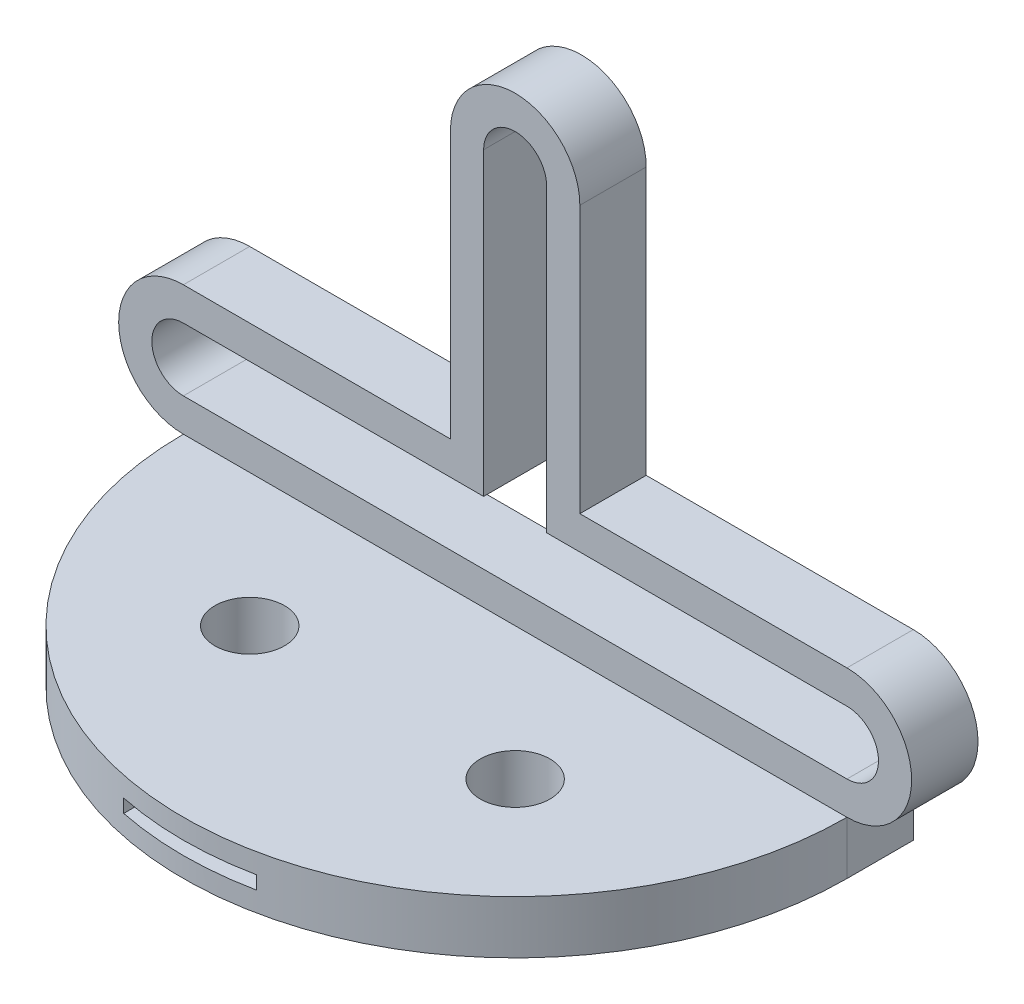
ISO-10303-21;
HEADER;
FILE_DESCRIPTION(('STEP AP214'),'2;1');
FILE_NAME('part.step','',(''),(''),'','','');
FILE_SCHEMA(('AUTOMOTIVE_DESIGN { 1 0 10303 214 1 1 1 1 }'));
ENDSEC;
DATA;
#1=APPLICATION_CONTEXT('core data for automotive mechanical design processes');
#2=APPLICATION_PROTOCOL_DEFINITION('international standard','automotive_design',2000,#1);
#3=PRODUCT_CONTEXT('',#1,'mechanical');
#4=PRODUCT('Part','Part','',(#3));
#5=PRODUCT_RELATED_PRODUCT_CATEGORY('part','',(#4));
#6=PRODUCT_DEFINITION_FORMATION('','',#4);
#7=PRODUCT_DEFINITION_CONTEXT('part definition',#1,'design');
#8=PRODUCT_DEFINITION('design','',#6,#7);
#9=PRODUCT_DEFINITION_SHAPE('','',#8);
#10=(LENGTH_UNIT() NAMED_UNIT(*) SI_UNIT(.MILLI.,.METRE.));
#11=(NAMED_UNIT(*) PLANE_ANGLE_UNIT() SI_UNIT($,.RADIAN.));
#12=(NAMED_UNIT(*) SI_UNIT($,.STERADIAN.) SOLID_ANGLE_UNIT());
#13=UNCERTAINTY_MEASURE_WITH_UNIT(LENGTH_MEASURE(1.E-05),#10,'distance_accuracy_value','');
#14=(GEOMETRIC_REPRESENTATION_CONTEXT(3) GLOBAL_UNCERTAINTY_ASSIGNED_CONTEXT((#13)) GLOBAL_UNIT_ASSIGNED_CONTEXT((#10,
#11,#12)) REPRESENTATION_CONTEXT('',''));
#15=CARTESIAN_POINT('',(0.,0.,0.));
#16=DIRECTION('',(0.,0.,1.));
#17=DIRECTION('',(1.,0.,0.));
#18=AXIS2_PLACEMENT_3D('',#15,#16,#17);
#19=CARTESIAN_POINT('',(10.,-14.75,50.));
#20=DIRECTION('',(0.,-1.,0.));
#21=DIRECTION('',(0.,0.,-1.));
#22=AXIS2_PLACEMENT_3D('',#19,#20,#21);
#23=PLANE('',#22);
#24=DIRECTION('',(0.,0.,-1.));
#25=VECTOR('',#24,1.);
#26=CARTESIAN_POINT('',(10.,-14.75,50.));
#27=LINE('',#26,#25);
#28=CARTESIAN_POINT('',(10.,-14.75,48.9897948556635));
#29=VERTEX_POINT('',#28);
#30=CARTESIAN_POINT('',(10.,-14.75,20.));
#31=VERTEX_POINT('',#30);
#32=EDGE_CURVE('E201',#29,#31,#27,.T.);
#33=ORIENTED_EDGE('',*,*,#32,.T.);
#34=CARTESIAN_POINT('',(0.,-14.75,20.));
#35=DIRECTION('',(0.,-1.,0.));
#36=DIRECTION('',(0.,0.,-1.));
#37=AXIS2_PLACEMENT_3D('',#34,#35,#36);
#38=CIRCLE('',#37,10.);
#39=CARTESIAN_POINT('',(-10.,-14.75,20.));
#40=VERTEX_POINT('',#39);
#41=EDGE_CURVE('E48',#40,#31,#38,.F.);
#42=ORIENTED_EDGE('',*,*,#41,.F.);
#43=DIRECTION('',(0.,0.,-1.));
#44=VECTOR('',#43,1.);
#45=CARTESIAN_POINT('',(-10.,-14.75,50.));
#46=LINE('',#45,#44);
#47=CARTESIAN_POINT('',(-10.,-14.75,48.9897948556635));
#48=VERTEX_POINT('',#47);
#49=EDGE_CURVE('E199',#48,#40,#46,.T.);
#50=ORIENTED_EDGE('',*,*,#49,.F.);
#51=CARTESIAN_POINT('',(0.,-14.75,0.));
#52=DIRECTION('',(0.,-1.,0.));
#53=DIRECTION('',(0.,0.,-1.));
#54=AXIS2_PLACEMENT_3D('',#51,#52,#53);
#55=CIRCLE('',#54,50.);
#56=EDGE_CURVE('E42',#48,#29,#55,.F.);
#57=ORIENTED_EDGE('',*,*,#56,.T.);
#58=EDGE_LOOP('',(#33,#42,#50,#57));
#59=FACE_BOUND('',#58,.T.);
#60=ADVANCED_FACE('F34',(#59),#23,.F.);
#61=CARTESIAN_POINT('',(0.,4.75,-10.));
#62=DIRECTION('',(0.,-1.,0.));
#63=DIRECTION('',(1.,0.,0.));
#64=AXIS2_PLACEMENT_3D('',#61,#62,#63);
#65=PLANE('',#64);
#66=DIRECTION('',(1.,0.,0.));
#67=VECTOR('',#66,1.);
#68=CARTESIAN_POINT('',(0.,4.75,0.));
#69=LINE('',#68,#67);
#70=CARTESIAN_POINT('',(4.75000000000001,4.75,0.));
#71=VERTEX_POINT('',#70);
#72=CARTESIAN_POINT('',(50.,4.75,0.));
#73=VERTEX_POINT('',#72);
#74=EDGE_CURVE('E316',#71,#73,#69,.T.);
#75=ORIENTED_EDGE('',*,*,#74,.F.);
#76=DIRECTION('',(0.,0.,1.));
#77=VECTOR('',#76,1.);
#78=CARTESIAN_POINT('',(4.75000000000001,4.75,-10.));
#79=LINE('',#78,#77);
#80=CARTESIAN_POINT('',(4.75000000000001,4.75,-10.));
#81=VERTEX_POINT('',#80);
#82=EDGE_CURVE('E339',#81,#71,#79,.T.);
#83=ORIENTED_EDGE('',*,*,#82,.F.);
#84=DIRECTION('',(1.,0.,0.));
#85=VECTOR('',#84,1.);
#86=CARTESIAN_POINT('',(0.,4.75,-10.));
#87=LINE('',#86,#85);
#88=CARTESIAN_POINT('',(50.,4.75,-10.));
#89=VERTEX_POINT('',#88);
#90=EDGE_CURVE('E268',#81,#89,#87,.T.);
#91=ORIENTED_EDGE('',*,*,#90,.T.);
#92=DIRECTION('',(0.,0.,1.));
#93=VECTOR('',#92,1.);
#94=CARTESIAN_POINT('',(50.,4.75,-10.));
#95=LINE('',#94,#93);
#96=EDGE_CURVE('E357',#89,#73,#95,.T.);
#97=ORIENTED_EDGE('',*,*,#96,.T.);
#98=EDGE_LOOP('',(#75,#83,#91,#97));
#99=FACE_BOUND('',#98,.T.);
#100=ADVANCED_FACE('F469',(#99),#65,.T.);
#101=CARTESIAN_POINT('',(4.75000000000001,0.,-10.));
#102=DIRECTION('',(-1.,0.,0.));
#103=DIRECTION('',(0.,-1.,0.));
#104=AXIS2_PLACEMENT_3D('',#101,#102,#103);
#105=PLANE('',#104);
#106=DIRECTION('',(0.,-1.,0.));
#107=VECTOR('',#106,1.);
#108=CARTESIAN_POINT('',(4.75000000000001,0.,0.));
#109=LINE('',#108,#107);
#110=CARTESIAN_POINT('',(4.75,50.,0.));
#111=VERTEX_POINT('',#110);
#112=EDGE_CURVE('E244',#111,#71,#109,.T.);
#113=ORIENTED_EDGE('',*,*,#112,.F.);
#114=DIRECTION('',(0.,0.,1.));
#115=VECTOR('',#114,1.);
#116=CARTESIAN_POINT('',(4.75,50.,-10.));
#117=LINE('',#116,#115);
#118=CARTESIAN_POINT('',(4.75,50.,-10.));
#119=VERTEX_POINT('',#118);
#120=EDGE_CURVE('E342',#119,#111,#117,.T.);
#121=ORIENTED_EDGE('',*,*,#120,.F.);
#122=DIRECTION('',(0.,-1.,0.));
#123=VECTOR('',#122,1.);
#124=CARTESIAN_POINT('',(4.75000000000001,0.,-10.));
#125=LINE('',#124,#123);
#126=EDGE_CURVE('E288',#119,#81,#125,.T.);
#127=ORIENTED_EDGE('',*,*,#126,.T.);
#128=ORIENTED_EDGE('',*,*,#82,.T.);
#129=EDGE_LOOP('',(#113,#121,#127,#128));
#130=FACE_BOUND('',#129,.T.);
#131=ADVANCED_FACE('F474',(#130),#105,.T.);
#132=CARTESIAN_POINT('',(0.,50.,-10.));
#133=DIRECTION('',(0.,0.,1.));
#134=DIRECTION('',(1.,0.,0.));
#135=AXIS2_PLACEMENT_3D('',#132,#133,#134);
#136=CYLINDRICAL_SURFACE('',#135,4.75);
#137=CARTESIAN_POINT('',(0.,50.,0.));
#138=DIRECTION('',(0.,0.,1.));
#139=DIRECTION('',(1.,0.,0.));
#140=AXIS2_PLACEMENT_3D('',#137,#138,#139);
#141=CIRCLE('',#140,4.75);
#142=CARTESIAN_POINT('',(-4.75,50.,0.));
#143=VERTEX_POINT('',#142);
#144=EDGE_CURVE('E334',#143,#111,#141,.F.);
#145=ORIENTED_EDGE('',*,*,#144,.F.);
#146=DIRECTION('',(0.,0.,1.));
#147=VECTOR('',#146,1.);
#148=CARTESIAN_POINT('',(-4.75,50.,-10.));
#149=LINE('',#148,#147);
#150=CARTESIAN_POINT('',(-4.75,50.,-10.));
#151=VERTEX_POINT('',#150);
#152=EDGE_CURVE('E344',#151,#143,#149,.T.);
#153=ORIENTED_EDGE('',*,*,#152,.F.);
#154=CARTESIAN_POINT('',(0.,50.,-10.));
#155=DIRECTION('',(0.,0.,1.));
#156=DIRECTION('',(1.,0.,0.));
#157=AXIS2_PLACEMENT_3D('',#154,#155,#156);
#158=CIRCLE('',#157,4.75);
#159=EDGE_CURVE('E285',#151,#119,#158,.F.);
#160=ORIENTED_EDGE('',*,*,#159,.T.);
#161=ORIENTED_EDGE('',*,*,#120,.T.);
#162=EDGE_LOOP('',(#145,#153,#160,#161));
#163=FACE_BOUND('',#162,.T.);
#164=ADVANCED_FACE('F510',(#163),#136,.F.);
#165=CARTESIAN_POINT('',(-4.74999999999999,0.,-10.));
#166=DIRECTION('',(-1.,0.,0.));
#167=DIRECTION('',(0.,-1.,0.));
#168=AXIS2_PLACEMENT_3D('',#165,#166,#167);
#169=PLANE('',#168);
#170=DIRECTION('',(0.,-1.,0.));
#171=VECTOR('',#170,1.);
#172=CARTESIAN_POINT('',(-4.74999999999999,0.,0.));
#173=LINE('',#172,#171);
#174=CARTESIAN_POINT('',(-4.74999999999999,4.75000000000001,0.));
#175=VERTEX_POINT('',#174);
#176=EDGE_CURVE('E331',#143,#175,#173,.T.);
#177=ORIENTED_EDGE('',*,*,#176,.T.);
#178=DIRECTION('',(0.,0.,1.));
#179=VECTOR('',#178,1.);
#180=CARTESIAN_POINT('',(-4.74999999999999,4.75000000000001,-10.));
#181=LINE('',#180,#179);
#182=CARTESIAN_POINT('',(-4.74999999999999,4.75000000000001,-10.));
#183=VERTEX_POINT('',#182);
#184=EDGE_CURVE('E346',#183,#175,#181,.T.);
#185=ORIENTED_EDGE('',*,*,#184,.F.);
#186=DIRECTION('',(0.,-1.,0.));
#187=VECTOR('',#186,1.);
#188=CARTESIAN_POINT('',(-4.74999999999999,0.,-10.));
#189=LINE('',#188,#187);
#190=EDGE_CURVE('E282',#151,#183,#189,.T.);
#191=ORIENTED_EDGE('',*,*,#190,.F.);
#192=ORIENTED_EDGE('',*,*,#152,.T.);
#193=EDGE_LOOP('',(#177,#185,#191,#192));
#194=FACE_BOUND('',#193,.T.);
#195=ADVANCED_FACE('F514',(#194),#169,.F.);
#196=CARTESIAN_POINT('',(0.,4.75000000000001,-10.));
#197=DIRECTION('',(0.,1.,0.));
#198=DIRECTION('',(-1.,0.,0.));
#199=AXIS2_PLACEMENT_3D('',#196,#197,#198);
#200=PLANE('',#199);
#201=DIRECTION('',(-1.,0.,0.));
#202=VECTOR('',#201,1.);
#203=CARTESIAN_POINT('',(0.,4.75000000000001,0.));
#204=LINE('',#203,#202);
#205=CARTESIAN_POINT('',(-50.,4.75,0.));
#206=VERTEX_POINT('',#205);
#207=EDGE_CURVE('E328',#175,#206,#204,.T.);
#208=ORIENTED_EDGE('',*,*,#207,.T.);
#209=DIRECTION('',(0.,0.,1.));
#210=VECTOR('',#209,1.);
#211=CARTESIAN_POINT('',(-50.,4.75,-10.));
#212=LINE('',#211,#210);
#213=CARTESIAN_POINT('',(-50.,4.75,-10.));
#214=VERTEX_POINT('',#213);
#215=EDGE_CURVE('E349',#214,#206,#212,.T.);
#216=ORIENTED_EDGE('',*,*,#215,.F.);
#217=DIRECTION('',(-1.,0.,0.));
#218=VECTOR('',#217,1.);
#219=CARTESIAN_POINT('',(0.,4.75000000000001,-10.));
#220=LINE('',#219,#218);
#221=EDGE_CURVE('E279',#183,#214,#220,.T.);
#222=ORIENTED_EDGE('',*,*,#221,.F.);
#223=ORIENTED_EDGE('',*,*,#184,.T.);
#224=EDGE_LOOP('',(#208,#216,#222,#223));
#225=FACE_BOUND('',#224,.T.);
#226=ADVANCED_FACE('F518',(#225),#200,.F.);
#227=CARTESIAN_POINT('',(-50.,0.,-10.));
#228=DIRECTION('',(0.,0.,1.));
#229=DIRECTION('',(1.,0.,0.));
#230=AXIS2_PLACEMENT_3D('',#227,#228,#229);
#231=CYLINDRICAL_SURFACE('',#230,4.75);
#232=CARTESIAN_POINT('',(-50.,0.,0.));
#233=DIRECTION('',(0.,0.,1.));
#234=DIRECTION('',(1.,0.,0.));
#235=AXIS2_PLACEMENT_3D('',#232,#233,#234);
#236=CIRCLE('',#235,4.75);
#237=CARTESIAN_POINT('',(-50.,-4.75,0.));
#238=VERTEX_POINT('',#237);
#239=EDGE_CURVE('E325',#206,#238,#236,.T.);
#240=ORIENTED_EDGE('',*,*,#239,.T.);
#241=DIRECTION('',(0.,0.,1.));
#242=VECTOR('',#241,1.);
#243=CARTESIAN_POINT('',(-50.,-4.75,-10.));
#244=LINE('',#243,#242);
#245=CARTESIAN_POINT('',(-50.,-4.75,-10.));
#246=VERTEX_POINT('',#245);
#247=EDGE_CURVE('E352',#246,#238,#244,.T.);
#248=ORIENTED_EDGE('',*,*,#247,.F.);
#249=CARTESIAN_POINT('',(-50.,0.,-10.));
#250=DIRECTION('',(0.,0.,1.));
#251=DIRECTION('',(1.,0.,0.));
#252=AXIS2_PLACEMENT_3D('',#249,#250,#251);
#253=CIRCLE('',#252,4.75);
#254=EDGE_CURVE('E276',#214,#246,#253,.T.);
#255=ORIENTED_EDGE('',*,*,#254,.F.);
#256=ORIENTED_EDGE('',*,*,#215,.T.);
#257=EDGE_LOOP('',(#240,#248,#255,#256));
#258=FACE_BOUND('',#257,.T.);
#259=ADVANCED_FACE('F522',(#258),#231,.F.);
#260=CARTESIAN_POINT('',(0.,-4.75,-10.));
#261=DIRECTION('',(0.,-1.,0.));
#262=DIRECTION('',(1.,0.,0.));
#263=AXIS2_PLACEMENT_3D('',#260,#261,#262);
#264=PLANE('',#263);
#265=DIRECTION('',(1.,0.,0.));
#266=VECTOR('',#265,1.);
#267=CARTESIAN_POINT('',(0.,-4.75,0.));
#268=LINE('',#267,#266);
#269=CARTESIAN_POINT('',(50.,-4.75,0.));
#270=VERTEX_POINT('',#269);
#271=EDGE_CURVE('E322',#238,#270,#268,.T.);
#272=ORIENTED_EDGE('',*,*,#271,.T.);
#273=DIRECTION('',(0.,0.,1.));
#274=VECTOR('',#273,1.);
#275=CARTESIAN_POINT('',(50.,-4.75,-10.));
#276=LINE('',#275,#274);
#277=CARTESIAN_POINT('',(50.,-4.75,-10.));
#278=VERTEX_POINT('',#277);
#279=EDGE_CURVE('E355',#278,#270,#276,.T.);
#280=ORIENTED_EDGE('',*,*,#279,.F.);
#281=DIRECTION('',(1.,0.,0.));
#282=VECTOR('',#281,1.);
#283=CARTESIAN_POINT('',(0.,-4.75,-10.));
#284=LINE('',#283,#282);
#285=EDGE_CURVE('E274',#246,#278,#284,.T.);
#286=ORIENTED_EDGE('',*,*,#285,.F.);
#287=ORIENTED_EDGE('',*,*,#247,.T.);
#288=EDGE_LOOP('',(#272,#280,#286,#287));
#289=FACE_BOUND('',#288,.T.);
#290=ADVANCED_FACE('F526',(#289),#264,.F.);
#291=CARTESIAN_POINT('',(0.,50.,-10.));
#292=DIRECTION('',(0.,0.,1.));
#293=DIRECTION('',(1.,0.,0.));
#294=AXIS2_PLACEMENT_3D('',#291,#292,#293);
#295=CYLINDRICAL_SURFACE('',#294,9.75);
#296=CARTESIAN_POINT('',(0.,50.,0.));
#297=DIRECTION('',(0.,0.,1.));
#298=DIRECTION('',(1.,0.,0.));
#299=AXIS2_PLACEMENT_3D('',#296,#297,#298);
#300=CIRCLE('',#299,9.75);
#301=CARTESIAN_POINT('',(-9.75,50.,0.));
#302=VERTEX_POINT('',#301);
#303=CARTESIAN_POINT('',(9.75,50.,0.));
#304=VERTEX_POINT('',#303);
#305=EDGE_CURVE('E237',#302,#304,#300,.F.);
#306=ORIENTED_EDGE('',*,*,#305,.T.);
#307=DIRECTION('',(0.,0.,1.));
#308=VECTOR('',#307,1.);
#309=CARTESIAN_POINT('',(9.75,50.,-10.));
#310=LINE('',#309,#308);
#311=CARTESIAN_POINT('',(9.75,50.,-10.));
#312=VERTEX_POINT('',#311);
#313=EDGE_CURVE('E359',#312,#304,#310,.T.);
#314=ORIENTED_EDGE('',*,*,#313,.F.);
#315=CARTESIAN_POINT('',(0.,50.,-10.));
#316=DIRECTION('',(0.,0.,1.));
#317=DIRECTION('',(1.,0.,0.));
#318=AXIS2_PLACEMENT_3D('',#315,#316,#317);
#319=CIRCLE('',#318,9.75);
#320=CARTESIAN_POINT('',(-9.75,50.,-10.));
#321=VERTEX_POINT('',#320);
#322=EDGE_CURVE('E240',#321,#312,#319,.F.);
#323=ORIENTED_EDGE('',*,*,#322,.F.);
#324=DIRECTION('',(0.,0.,1.));
#325=VECTOR('',#324,1.);
#326=CARTESIAN_POINT('',(-9.75,50.,-10.));
#327=LINE('',#326,#325);
#328=EDGE_CURVE('E291',#321,#302,#327,.T.);
#329=ORIENTED_EDGE('',*,*,#328,.T.);
#330=EDGE_LOOP('',(#306,#314,#323,#329));
#331=FACE_BOUND('',#330,.T.);
#332=ADVANCED_FACE('F36',(#331),#295,.T.);
#333=CARTESIAN_POINT('',(9.75,0.,-10.));
#334=DIRECTION('',(-1.,0.,0.));
#335=DIRECTION('',(0.,0.,1.));
#336=AXIS2_PLACEMENT_3D('',#333,#334,#335);
#337=PLANE('',#336);
#338=DIRECTION('',(0.,-1.,0.));
#339=VECTOR('',#338,1.);
#340=CARTESIAN_POINT('',(9.75,0.,0.));
#341=LINE('',#340,#339);
#342=CARTESIAN_POINT('',(9.75,9.75,0.));
#343=VERTEX_POINT('',#342);
#344=EDGE_CURVE('E314',#304,#343,#341,.T.);
#345=ORIENTED_EDGE('',*,*,#344,.T.);
#346=DIRECTION('',(0.,0.,1.));
#347=VECTOR('',#346,1.);
#348=CARTESIAN_POINT('',(9.75,9.75,-10.));
#349=LINE('',#348,#347);
#350=CARTESIAN_POINT('',(9.75,9.75,-10.));
#351=VERTEX_POINT('',#350);
#352=EDGE_CURVE('E362',#351,#343,#349,.T.);
#353=ORIENTED_EDGE('',*,*,#352,.F.);
#354=DIRECTION('',(0.,-1.,0.));
#355=VECTOR('',#354,1.);
#356=CARTESIAN_POINT('',(9.75,0.,-10.));
#357=LINE('',#356,#355);
#358=EDGE_CURVE('E266',#312,#351,#357,.T.);
#359=ORIENTED_EDGE('',*,*,#358,.F.);
#360=ORIENTED_EDGE('',*,*,#313,.T.);
#361=EDGE_LOOP('',(#345,#353,#359,#360));
#362=FACE_BOUND('',#361,.T.);
#363=ADVANCED_FACE('F452',(#362),#337,.F.);
#364=CARTESIAN_POINT('',(0.,9.75,-10.));
#365=DIRECTION('',(0.,-1.,0.));
#366=DIRECTION('',(1.,0.,0.));
#367=AXIS2_PLACEMENT_3D('',#364,#365,#366);
#368=PLANE('',#367);
#369=DIRECTION('',(1.,0.,0.));
#370=VECTOR('',#369,1.);
#371=CARTESIAN_POINT('',(0.,9.75,0.));
#372=LINE('',#371,#370);
#373=CARTESIAN_POINT('',(50.,9.75,0.));
#374=VERTEX_POINT('',#373);
#375=EDGE_CURVE('E312',#343,#374,#372,.T.);
#376=ORIENTED_EDGE('',*,*,#375,.T.);
#377=DIRECTION('',(0.,0.,1.));
#378=VECTOR('',#377,1.);
#379=CARTESIAN_POINT('',(50.,9.75,-10.));
#380=LINE('',#379,#378);
#381=CARTESIAN_POINT('',(50.,9.75,-10.));
#382=VERTEX_POINT('',#381);
#383=EDGE_CURVE('E365',#382,#374,#380,.T.);
#384=ORIENTED_EDGE('',*,*,#383,.F.);
#385=DIRECTION('',(1.,0.,0.));
#386=VECTOR('',#385,1.);
#387=CARTESIAN_POINT('',(0.,9.75,-10.));
#388=LINE('',#387,#386);
#389=EDGE_CURVE('E264',#351,#382,#388,.T.);
#390=ORIENTED_EDGE('',*,*,#389,.F.);
#391=ORIENTED_EDGE('',*,*,#352,.T.);
#392=EDGE_LOOP('',(#376,#384,#390,#391));
#393=FACE_BOUND('',#392,.T.);
#394=ADVANCED_FACE('F457',(#393),#368,.F.);
#395=CARTESIAN_POINT('',(50.,0.,-10.));
#396=DIRECTION('',(0.,0.,1.));
#397=DIRECTION('',(1.,0.,0.));
#398=AXIS2_PLACEMENT_3D('',#395,#396,#397);
#399=CYLINDRICAL_SURFACE('',#398,9.75);
#400=CARTESIAN_POINT('',(50.,0.,0.));
#401=DIRECTION('',(0.,0.,1.));
#402=DIRECTION('',(1.,0.,0.));
#403=AXIS2_PLACEMENT_3D('',#400,#401,#402);
#404=CIRCLE('',#403,9.75);
#405=CARTESIAN_POINT('',(50.,-9.75,0.));
#406=VERTEX_POINT('',#405);
#407=EDGE_CURVE('E309',#374,#406,#404,.F.);
#408=ORIENTED_EDGE('',*,*,#407,.T.);
#409=DIRECTION('',(0.,0.,1.));
#410=VECTOR('',#409,1.);
#411=CARTESIAN_POINT('',(50.,-9.75,-10.));
#412=LINE('',#411,#410);
#413=CARTESIAN_POINT('',(50.,-9.75,-10.));
#414=VERTEX_POINT('',#413);
#415=EDGE_CURVE('E368',#414,#406,#412,.T.);
#416=ORIENTED_EDGE('',*,*,#415,.F.);
#417=CARTESIAN_POINT('',(50.,0.,-10.));
#418=DIRECTION('',(0.,0.,1.));
#419=DIRECTION('',(1.,0.,0.));
#420=AXIS2_PLACEMENT_3D('',#417,#418,#419);
#421=CIRCLE('',#420,9.75);
#422=EDGE_CURVE('E262',#382,#414,#421,.F.);
#423=ORIENTED_EDGE('',*,*,#422,.F.);
#424=ORIENTED_EDGE('',*,*,#383,.T.);
#425=EDGE_LOOP('',(#408,#416,#423,#424));
#426=FACE_BOUND('',#425,.T.);
#427=ADVANCED_FACE('F461',(#426),#399,.T.);
#428=CARTESIAN_POINT('',(50.,0.,-10.));
#429=DIRECTION('',(1.,0.,0.));
#430=DIRECTION('',(0.,0.,-1.));
#431=AXIS2_PLACEMENT_3D('',#428,#429,#430);
#432=PLANE('',#431);
#433=DIRECTION('',(0.,1.,0.));
#434=VECTOR('',#433,1.);
#435=CARTESIAN_POINT('',(50.,0.,0.));
#436=LINE('',#435,#434);
#437=CARTESIAN_POINT('',(50.,-17.75,0.));
#438=VERTEX_POINT('',#437);
#439=EDGE_CURVE('E306',#438,#406,#436,.T.);
#440=ORIENTED_EDGE('',*,*,#439,.F.);
#441=DIRECTION('',(0.,0.,1.));
#442=VECTOR('',#441,1.);
#443=CARTESIAN_POINT('',(50.,-17.75,-10.));
#444=LINE('',#443,#442);
#445=CARTESIAN_POINT('',(50.,-17.75,-10.));
#446=VERTEX_POINT('',#445);
#447=EDGE_CURVE('E371',#446,#438,#444,.T.);
#448=ORIENTED_EDGE('',*,*,#447,.F.);
#449=DIRECTION('',(0.,1.,0.));
#450=VECTOR('',#449,1.);
#451=CARTESIAN_POINT('',(50.,0.,-10.));
#452=LINE('',#451,#450);
#453=EDGE_CURVE('E259',#446,#414,#452,.T.);
#454=ORIENTED_EDGE('',*,*,#453,.T.);
#455=ORIENTED_EDGE('',*,*,#415,.T.);
#456=EDGE_LOOP('',(#440,#448,#454,#455));
#457=FACE_BOUND('',#456,.T.);
#458=ADVANCED_FACE('F414',(#457),#432,.T.);
#459=CARTESIAN_POINT('',(0.,-17.75,-10.));
#460=DIRECTION('',(0.,-1.,0.));
#461=DIRECTION('',(0.,0.,-1.));
#462=AXIS2_PLACEMENT_3D('',#459,#460,#461);
#463=PLANE('',#462);
#464=CARTESIAN_POINT('',(0.,-17.75,20.));
#465=DIRECTION('',(0.,-1.,0.));
#466=DIRECTION('',(0.,0.,-1.));
#467=AXIS2_PLACEMENT_3D('',#464,#465,#466);
#468=CIRCLE('',#467,10.);
#469=CARTESIAN_POINT('',(0.,-17.75,10.));
#470=VERTEX_POINT('',#469);
#471=EDGE_CURVE('E193',#470,#470,#468,.T.);
#472=ORIENTED_EDGE('',*,*,#471,.F.);
#473=EDGE_LOOP('',(#472));
#474=FACE_BOUND('',#473,.T.);
#475=CARTESIAN_POINT('',(-20.,-17.75,20.));
#476=DIRECTION('',(0.,1.,0.));
#477=DIRECTION('',(0.,0.,1.));
#478=AXIS2_PLACEMENT_3D('',#475,#476,#477);
#479=CIRCLE('',#478,5.25);
#480=CARTESIAN_POINT('',(-20.,-17.75,25.25));
#481=VERTEX_POINT('',#480);
#482=EDGE_CURVE('E212',#481,#481,#479,.T.);
#483=ORIENTED_EDGE('',*,*,#482,.T.);
#484=EDGE_LOOP('',(#483));
#485=FACE_BOUND('',#484,.T.);
#486=CARTESIAN_POINT('',(20.,-17.75,20.));
#487=DIRECTION('',(0.,1.,0.));
#488=DIRECTION('',(0.,0.,1.));
#489=AXIS2_PLACEMENT_3D('',#486,#487,#488);
#490=CIRCLE('',#489,5.25);
#491=CARTESIAN_POINT('',(20.,-17.75,25.25));
#492=VERTEX_POINT('',#491);
#493=EDGE_CURVE('E226',#492,#492,#490,.T.);
#494=ORIENTED_EDGE('',*,*,#493,.T.);
#495=EDGE_LOOP('',(#494));
#496=FACE_BOUND('',#495,.T.);
#497=ORIENTED_EDGE('',*,*,#447,.T.);
#498=CARTESIAN_POINT('',(0.,-17.75,0.));
#499=DIRECTION('',(0.,-1.,0.));
#500=DIRECTION('',(0.,0.,1.));
#501=AXIS2_PLACEMENT_3D('',#498,#499,#500);
#502=CIRCLE('',#501,50.);
#503=CARTESIAN_POINT('',(-50.,-17.75,0.));
#504=VERTEX_POINT('',#503);
#505=EDGE_CURVE('E229',#438,#504,#502,.T.);
#506=ORIENTED_EDGE('',*,*,#505,.T.);
#507=DIRECTION('',(0.,0.,1.));
#508=VECTOR('',#507,1.);
#509=CARTESIAN_POINT('',(-50.,-17.75,-10.));
#510=LINE('',#509,#508);
#511=CARTESIAN_POINT('',(-50.,-17.75,-10.));
#512=VERTEX_POINT('',#511);
#513=EDGE_CURVE('E374',#512,#504,#510,.T.);
#514=ORIENTED_EDGE('',*,*,#513,.F.);
#515=DIRECTION('',(1.,0.,0.));
#516=VECTOR('',#515,1.);
#517=CARTESIAN_POINT('',(0.,-17.75,-10.));
#518=LINE('',#517,#516);
#519=EDGE_CURVE('E256',#512,#446,#518,.T.);
#520=ORIENTED_EDGE('',*,*,#519,.T.);
#521=EDGE_LOOP('',(#497,#506,#514,#520));
#522=FACE_BOUND('',#521,.T.);
#523=ADVANCED_FACE('F410',(#474,#485,#496,#522),#463,.T.);
#524=CARTESIAN_POINT('',(-50.,0.,-10.));
#525=DIRECTION('',(-1.,0.,0.));
#526=DIRECTION('',(0.,0.,1.));
#527=AXIS2_PLACEMENT_3D('',#524,#525,#526);
#528=PLANE('',#527);
#529=DIRECTION('',(0.,-1.,0.));
#530=VECTOR('',#529,1.);
#531=CARTESIAN_POINT('',(-50.,0.,0.));
#532=LINE('',#531,#530);
#533=CARTESIAN_POINT('',(-50.,-9.75,0.));
#534=VERTEX_POINT('',#533);
#535=EDGE_CURVE('E303',#534,#504,#532,.T.);
#536=ORIENTED_EDGE('',*,*,#535,.F.);
#537=DIRECTION('',(0.,0.,1.));
#538=VECTOR('',#537,1.);
#539=CARTESIAN_POINT('',(-50.,-9.75,-10.));
#540=LINE('',#539,#538);
#541=CARTESIAN_POINT('',(-50.,-9.75,-10.));
#542=VERTEX_POINT('',#541);
#543=EDGE_CURVE('E376',#542,#534,#540,.T.);
#544=ORIENTED_EDGE('',*,*,#543,.F.);
#545=DIRECTION('',(0.,-1.,0.));
#546=VECTOR('',#545,1.);
#547=CARTESIAN_POINT('',(-50.,0.,-10.));
#548=LINE('',#547,#546);
#549=EDGE_CURVE('E253',#542,#512,#548,.T.);
#550=ORIENTED_EDGE('',*,*,#549,.T.);
#551=ORIENTED_EDGE('',*,*,#513,.T.);
#552=EDGE_LOOP('',(#536,#544,#550,#551));
#553=FACE_BOUND('',#552,.T.);
#554=ADVANCED_FACE('F413',(#553),#528,.T.);
#555=CARTESIAN_POINT('',(-50.,0.,-10.));
#556=DIRECTION('',(0.,0.,1.));
#557=DIRECTION('',(1.,0.,0.));
#558=AXIS2_PLACEMENT_3D('',#555,#556,#557);
#559=CYLINDRICAL_SURFACE('',#558,9.75000000000001);
#560=CARTESIAN_POINT('',(-50.,0.,0.));
#561=DIRECTION('',(0.,0.,1.));
#562=DIRECTION('',(1.,0.,0.));
#563=AXIS2_PLACEMENT_3D('',#560,#561,#562);
#564=CIRCLE('',#563,9.75000000000001);
#565=CARTESIAN_POINT('',(-50.,9.75000000000001,0.));
#566=VERTEX_POINT('',#565);
#567=EDGE_CURVE('E300',#566,#534,#564,.T.);
#568=ORIENTED_EDGE('',*,*,#567,.F.);
#569=DIRECTION('',(0.,0.,1.));
#570=VECTOR('',#569,1.);
#571=CARTESIAN_POINT('',(-50.,9.75000000000001,-10.));
#572=LINE('',#571,#570);
#573=CARTESIAN_POINT('',(-50.,9.75000000000001,-10.));
#574=VERTEX_POINT('',#573);
#575=EDGE_CURVE('E378',#574,#566,#572,.T.);
#576=ORIENTED_EDGE('',*,*,#575,.F.);
#577=CARTESIAN_POINT('',(-50.,0.,-10.));
#578=DIRECTION('',(0.,0.,1.));
#579=DIRECTION('',(1.,0.,0.));
#580=AXIS2_PLACEMENT_3D('',#577,#578,#579);
#581=CIRCLE('',#580,9.75000000000001);
#582=EDGE_CURVE('E250',#574,#542,#581,.T.);
#583=ORIENTED_EDGE('',*,*,#582,.T.);
#584=ORIENTED_EDGE('',*,*,#543,.T.);
#585=EDGE_LOOP('',(#568,#576,#583,#584));
#586=FACE_BOUND('',#585,.T.);
#587=ADVANCED_FACE('F436',(#586),#559,.T.);
#588=CARTESIAN_POINT('',(0.,9.75000000000001,-10.));
#589=DIRECTION('',(0.,1.,0.));
#590=DIRECTION('',(0.,0.,1.));
#591=AXIS2_PLACEMENT_3D('',#588,#589,#590);
#592=PLANE('',#591);
#593=DIRECTION('',(-1.,0.,0.));
#594=VECTOR('',#593,1.);
#595=CARTESIAN_POINT('',(0.,9.75000000000001,0.));
#596=LINE('',#595,#594);
#597=CARTESIAN_POINT('',(-9.75,9.75000000000001,0.));
#598=VERTEX_POINT('',#597);
#599=EDGE_CURVE('E297',#598,#566,#596,.T.);
#600=ORIENTED_EDGE('',*,*,#599,.F.);
#601=DIRECTION('',(0.,0.,1.));
#602=VECTOR('',#601,1.);
#603=CARTESIAN_POINT('',(-9.75,9.75000000000001,-10.));
#604=LINE('',#603,#602);
#605=CARTESIAN_POINT('',(-9.75,9.75000000000001,-10.));
#606=VERTEX_POINT('',#605);
#607=EDGE_CURVE('E380',#606,#598,#604,.T.);
#608=ORIENTED_EDGE('',*,*,#607,.F.);
#609=DIRECTION('',(-1.,0.,0.));
#610=VECTOR('',#609,1.);
#611=CARTESIAN_POINT('',(0.,9.75000000000001,-10.));
#612=LINE('',#611,#610);
#613=EDGE_CURVE('E247',#606,#574,#612,.T.);
#614=ORIENTED_EDGE('',*,*,#613,.T.);
#615=ORIENTED_EDGE('',*,*,#575,.T.);
#616=EDGE_LOOP('',(#600,#608,#614,#615));
#617=FACE_BOUND('',#616,.T.);
#618=ADVANCED_FACE('F442',(#617),#592,.T.);
#619=CARTESIAN_POINT('',(-9.75,0.,-10.));
#620=DIRECTION('',(-1.,0.,0.));
#621=DIRECTION('',(0.,0.,1.));
#622=AXIS2_PLACEMENT_3D('',#619,#620,#621);
#623=PLANE('',#622);
#624=DIRECTION('',(0.,-1.,0.));
#625=VECTOR('',#624,1.);
#626=CARTESIAN_POINT('',(-9.75,0.,0.));
#627=LINE('',#626,#625);
#628=EDGE_CURVE('E294',#302,#598,#627,.T.);
#629=ORIENTED_EDGE('',*,*,#628,.F.);
#630=ORIENTED_EDGE('',*,*,#328,.F.);
#631=DIRECTION('',(0.,-1.,0.));
#632=VECTOR('',#631,1.);
#633=CARTESIAN_POINT('',(-9.75,0.,-10.));
#634=LINE('',#633,#632);
#635=EDGE_CURVE('E243',#321,#606,#634,.T.);
#636=ORIENTED_EDGE('',*,*,#635,.T.);
#637=ORIENTED_EDGE('',*,*,#607,.T.);
#638=EDGE_LOOP('',(#629,#630,#636,#637));
#639=FACE_BOUND('',#638,.T.);
#640=ADVANCED_FACE('F445',(#639),#623,.T.);
#641=CARTESIAN_POINT('',(50.,0.,-10.));
#642=DIRECTION('',(0.,0.,1.));
#643=DIRECTION('',(1.,0.,0.));
#644=AXIS2_PLACEMENT_3D('',#641,#642,#643);
#645=CYLINDRICAL_SURFACE('',#644,4.75);
#646=CARTESIAN_POINT('',(50.,0.,0.));
#647=DIRECTION('',(0.,0.,1.));
#648=DIRECTION('',(1.,0.,0.));
#649=AXIS2_PLACEMENT_3D('',#646,#647,#648);
#650=CIRCLE('',#649,4.75);
#651=EDGE_CURVE('E319',#73,#270,#650,.F.);
#652=ORIENTED_EDGE('',*,*,#651,.F.);
#653=ORIENTED_EDGE('',*,*,#96,.F.);
#654=CARTESIAN_POINT('',(50.,0.,-10.));
#655=DIRECTION('',(0.,0.,1.));
#656=DIRECTION('',(1.,0.,0.));
#657=AXIS2_PLACEMENT_3D('',#654,#655,#656);
#658=CIRCLE('',#657,4.75);
#659=EDGE_CURVE('E271',#89,#278,#658,.F.);
#660=ORIENTED_EDGE('',*,*,#659,.T.);
#661=ORIENTED_EDGE('',*,*,#279,.T.);
#662=EDGE_LOOP('',(#652,#653,#660,#661));
#663=FACE_BOUND('',#662,.T.);
#664=ADVANCED_FACE('F505',(#663),#645,.F.);
#665=CARTESIAN_POINT('',(0.,0.,-10.));
#666=DIRECTION('',(0.,0.,1.));
#667=DIRECTION('',(1.,0.,0.));
#668=AXIS2_PLACEMENT_3D('',#665,#666,#667);
#669=PLANE('',#668);
#670=DIRECTION('',(1.,0.,0.));
#671=VECTOR('',#670,1.);
#672=CARTESIAN_POINT('',(10.,-12.75,-10.));
#673=LINE('',#672,#671);
#674=CARTESIAN_POINT('',(-10.,-12.75,-10.));
#675=VERTEX_POINT('',#674);
#676=CARTESIAN_POINT('',(10.,-12.75,-10.));
#677=VERTEX_POINT('',#676);
#678=EDGE_CURVE('E398',#675,#677,#673,.T.);
#679=ORIENTED_EDGE('',*,*,#678,.F.);
#680=DIRECTION('',(0.,1.,0.));
#681=VECTOR('',#680,1.);
#682=CARTESIAN_POINT('',(-10.,-12.75,-10.));
#683=LINE('',#682,#681);
#684=CARTESIAN_POINT('',(-10.,-14.75,-10.));
#685=VERTEX_POINT('',#684);
#686=EDGE_CURVE('E56',#685,#675,#683,.T.);
#687=ORIENTED_EDGE('',*,*,#686,.F.);
#688=DIRECTION('',(-1.,0.,0.));
#689=VECTOR('',#688,1.);
#690=CARTESIAN_POINT('',(10.,-14.75,-10.));
#691=LINE('',#690,#689);
#692=CARTESIAN_POINT('',(10.,-14.75,-10.));
#693=VERTEX_POINT('',#692);
#694=EDGE_CURVE('E206',#693,#685,#691,.T.);
#695=ORIENTED_EDGE('',*,*,#694,.F.);
#696=DIRECTION('',(0.,-1.,0.));
#697=VECTOR('',#696,1.);
#698=CARTESIAN_POINT('',(10.,-12.75,-10.));
#699=LINE('',#698,#697);
#700=EDGE_CURVE('E400',#677,#693,#699,.T.);
#701=ORIENTED_EDGE('',*,*,#700,.F.);
#702=EDGE_LOOP('',(#679,#687,#695,#701));
#703=FACE_BOUND('',#702,.T.);
#704=ORIENTED_EDGE('',*,*,#322,.T.);
#705=ORIENTED_EDGE('',*,*,#358,.T.);
#706=ORIENTED_EDGE('',*,*,#389,.T.);
#707=ORIENTED_EDGE('',*,*,#422,.T.);
#708=ORIENTED_EDGE('',*,*,#453,.F.);
#709=ORIENTED_EDGE('',*,*,#519,.F.);
#710=ORIENTED_EDGE('',*,*,#549,.F.);
#711=ORIENTED_EDGE('',*,*,#582,.F.);
#712=ORIENTED_EDGE('',*,*,#613,.F.);
#713=ORIENTED_EDGE('',*,*,#635,.F.);
#714=EDGE_LOOP('',(#704,#705,#706,#707,#708,#709,#710,#711,#712,#713));
#715=FACE_BOUND('',#714,.T.);
#716=ORIENTED_EDGE('',*,*,#90,.F.);
#717=ORIENTED_EDGE('',*,*,#126,.F.);
#718=ORIENTED_EDGE('',*,*,#159,.F.);
#719=ORIENTED_EDGE('',*,*,#190,.T.);
#720=ORIENTED_EDGE('',*,*,#221,.T.);
#721=ORIENTED_EDGE('',*,*,#254,.T.);
#722=ORIENTED_EDGE('',*,*,#285,.T.);
#723=ORIENTED_EDGE('',*,*,#659,.F.);
#724=EDGE_LOOP('',(#716,#717,#718,#719,#720,#721,#722,#723));
#725=FACE_BOUND('',#724,.T.);
#726=ADVANCED_FACE('F402',(#703,#715,#725),#669,.F.);
#727=CARTESIAN_POINT('',(0.,0.,0.));
#728=DIRECTION('',(0.,0.,1.));
#729=DIRECTION('',(1.,0.,0.));
#730=AXIS2_PLACEMENT_3D('',#727,#728,#729);
#731=PLANE('',#730);
#732=DIRECTION('',(1.,0.,0.));
#733=VECTOR('',#732,1.);
#734=CARTESIAN_POINT('',(-50.,-9.74999999999999,0.));
#735=LINE('',#734,#733);
#736=EDGE_CURVE('E235',#534,#406,#735,.T.);
#737=ORIENTED_EDGE('',*,*,#736,.T.);
#738=ORIENTED_EDGE('',*,*,#407,.F.);
#739=ORIENTED_EDGE('',*,*,#375,.F.);
#740=ORIENTED_EDGE('',*,*,#344,.F.);
#741=ORIENTED_EDGE('',*,*,#305,.F.);
#742=ORIENTED_EDGE('',*,*,#628,.T.);
#743=ORIENTED_EDGE('',*,*,#599,.T.);
#744=ORIENTED_EDGE('',*,*,#567,.T.);
#745=EDGE_LOOP('',(#737,#738,#739,#740,#741,#742,#743,#744));
#746=FACE_BOUND('',#745,.T.);
#747=ORIENTED_EDGE('',*,*,#74,.T.);
#748=ORIENTED_EDGE('',*,*,#651,.T.);
#749=ORIENTED_EDGE('',*,*,#271,.F.);
#750=ORIENTED_EDGE('',*,*,#239,.F.);
#751=ORIENTED_EDGE('',*,*,#207,.F.);
#752=ORIENTED_EDGE('',*,*,#176,.F.);
#753=ORIENTED_EDGE('',*,*,#144,.T.);
#754=ORIENTED_EDGE('',*,*,#112,.T.);
#755=EDGE_LOOP('',(#747,#748,#749,#750,#751,#752,#753,#754));
#756=FACE_BOUND('',#755,.T.);
#757=ADVANCED_FACE('F431',(#746,#756),#731,.T.);
#758=CARTESIAN_POINT('',(0.,-9.74999999999999,0.));
#759=DIRECTION('',(0.,-1.,0.));
#760=DIRECTION('',(0.,0.,-1.));
#761=AXIS2_PLACEMENT_3D('',#758,#759,#760);
#762=CYLINDRICAL_SURFACE('',#761,50.);
#763=DIRECTION('',(0.,-1.,0.));
#764=VECTOR('',#763,1.);
#765=CARTESIAN_POINT('',(-10.,-9.74999999999999,48.9897948556635));
#766=LINE('',#765,#764);
#767=CARTESIAN_POINT('',(-10.,-12.75,48.9897948556635));
#768=VERTEX_POINT('',#767);
#769=EDGE_CURVE('E11',#768,#48,#766,.T.);
#770=ORIENTED_EDGE('',*,*,#769,.F.);
#771=CARTESIAN_POINT('',(0.,-12.75,0.));
#772=DIRECTION('',(0.,1.,0.));
#773=DIRECTION('',(0.,0.,1.));
#774=AXIS2_PLACEMENT_3D('',#771,#772,#773);
#775=CIRCLE('',#774,50.);
#776=CARTESIAN_POINT('',(10.,-12.75,48.9897948556635));
#777=VERTEX_POINT('',#776);
#778=EDGE_CURVE('E341',#777,#768,#775,.F.);
#779=ORIENTED_EDGE('',*,*,#778,.F.);
#780=DIRECTION('',(0.,-1.,0.));
#781=VECTOR('',#780,1.);
#782=CARTESIAN_POINT('',(10.,-9.74999999999999,48.9897948556635));
#783=LINE('',#782,#781);
#784=EDGE_CURVE('E384',#29,#777,#783,.F.);
#785=ORIENTED_EDGE('',*,*,#784,.F.);
#786=ORIENTED_EDGE('',*,*,#56,.F.);
#787=EDGE_LOOP('',(#770,#779,#785,#786));
#788=FACE_BOUND('',#787,.T.);
#789=ORIENTED_EDGE('',*,*,#505,.F.);
#790=ORIENTED_EDGE('',*,*,#439,.T.);
#791=CARTESIAN_POINT('',(0.,-9.74999999999999,0.));
#792=DIRECTION('',(0.,-1.,0.));
#793=DIRECTION('',(0.,0.,1.));
#794=AXIS2_PLACEMENT_3D('',#791,#792,#793);
#795=CIRCLE('',#794,50.);
#796=EDGE_CURVE('E232',#406,#534,#795,.T.);
#797=ORIENTED_EDGE('',*,*,#796,.T.);
#798=ORIENTED_EDGE('',*,*,#535,.T.);
#799=EDGE_LOOP('',(#789,#790,#797,#798));
#800=FACE_BOUND('',#799,.T.);
#801=ADVANCED_FACE('F392',(#788,#800),#762,.T.);
#802=CARTESIAN_POINT('',(0.,-9.74999999999999,0.));
#803=DIRECTION('',(0.,1.,0.));
#804=DIRECTION('',(0.,0.,1.));
#805=AXIS2_PLACEMENT_3D('',#802,#803,#804);
#806=PLANE('',#805);
#807=CARTESIAN_POINT('',(-20.,-9.74999999999999,20.));
#808=DIRECTION('',(0.,1.,0.));
#809=DIRECTION('',(0.,0.,1.));
#810=AXIS2_PLACEMENT_3D('',#807,#808,#809);
#811=CIRCLE('',#810,5.25);
#812=CARTESIAN_POINT('',(-20.,-9.74999999999999,25.25));
#813=VERTEX_POINT('',#812);
#814=EDGE_CURVE('E210',#813,#813,#811,.T.);
#815=ORIENTED_EDGE('',*,*,#814,.F.);
#816=EDGE_LOOP('',(#815));
#817=FACE_BOUND('',#816,.T.);
#818=CARTESIAN_POINT('',(20.,-9.74999999999999,20.));
#819=DIRECTION('',(0.,1.,0.));
#820=DIRECTION('',(0.,0.,1.));
#821=AXIS2_PLACEMENT_3D('',#818,#819,#820);
#822=CIRCLE('',#821,5.25);
#823=CARTESIAN_POINT('',(20.,-9.74999999999999,25.25));
#824=VERTEX_POINT('',#823);
#825=EDGE_CURVE('E224',#824,#824,#822,.T.);
#826=ORIENTED_EDGE('',*,*,#825,.F.);
#827=EDGE_LOOP('',(#826));
#828=FACE_BOUND('',#827,.T.);
#829=ORIENTED_EDGE('',*,*,#796,.F.);
#830=ORIENTED_EDGE('',*,*,#736,.F.);
#831=EDGE_LOOP('',(#829,#830));
#832=FACE_BOUND('',#831,.T.);
#833=ADVANCED_FACE('F496',(#817,#828,#832),#806,.T.);
#834=CARTESIAN_POINT('',(20.,-17.75,20.));
#835=DIRECTION('',(0.,1.,0.));
#836=DIRECTION('',(0.,0.,1.));
#837=AXIS2_PLACEMENT_3D('',#834,#835,#836);
#838=CYLINDRICAL_SURFACE('',#837,5.25);
#839=ORIENTED_EDGE('',*,*,#493,.F.);
#840=EDGE_LOOP('',(#839));
#841=FACE_BOUND('',#840,.T.);
#842=ORIENTED_EDGE('',*,*,#825,.T.);
#843=EDGE_LOOP('',(#842));
#844=FACE_BOUND('',#843,.T.);
#845=ADVANCED_FACE('F489',(#841,#844),#838,.F.);
#846=CARTESIAN_POINT('',(-20.,-17.75,20.));
#847=DIRECTION('',(0.,1.,0.));
#848=DIRECTION('',(0.,0.,1.));
#849=AXIS2_PLACEMENT_3D('',#846,#847,#848);
#850=CYLINDRICAL_SURFACE('',#849,5.25);
#851=ORIENTED_EDGE('',*,*,#482,.F.);
#852=EDGE_LOOP('',(#851));
#853=FACE_BOUND('',#852,.T.);
#854=ORIENTED_EDGE('',*,*,#814,.T.);
#855=EDGE_LOOP('',(#854));
#856=FACE_BOUND('',#855,.T.);
#857=ADVANCED_FACE('F484',(#853,#856),#850,.F.);
#858=CARTESIAN_POINT('',(-10.,-12.75,50.));
#859=DIRECTION('',(-1.,0.,0.));
#860=DIRECTION('',(0.,0.,1.));
#861=AXIS2_PLACEMENT_3D('',#858,#859,#860);
#862=PLANE('',#861);
#863=ORIENTED_EDGE('',*,*,#769,.T.);
#864=ORIENTED_EDGE('',*,*,#49,.T.);
#865=EDGE_CURVE('E203',#40,#685,#46,.T.);
#866=ORIENTED_EDGE('',*,*,#865,.T.);
#867=ORIENTED_EDGE('',*,*,#686,.T.);
#868=DIRECTION('',(0.,0.,-1.));
#869=VECTOR('',#868,1.);
#870=CARTESIAN_POINT('',(-10.,-12.75,50.));
#871=LINE('',#870,#869);
#872=EDGE_CURVE('E221',#768,#675,#871,.T.);
#873=ORIENTED_EDGE('',*,*,#872,.F.);
#874=EDGE_LOOP('',(#863,#864,#866,#867,#873));
#875=FACE_BOUND('',#874,.T.);
#876=ADVANCED_FACE('F208',(#875),#862,.F.);
#877=ORIENTED_EDGE('',*,*,#865,.F.);
#878=EDGE_CURVE('E187',#31,#40,#38,.F.);
#879=ORIENTED_EDGE('',*,*,#878,.F.);
#880=EDGE_CURVE('E218',#31,#693,#27,.T.);
#881=ORIENTED_EDGE('',*,*,#880,.T.);
#882=ORIENTED_EDGE('',*,*,#694,.T.);
#883=EDGE_LOOP('',(#877,#879,#881,#882));
#884=FACE_BOUND('',#883,.T.);
#885=ADVANCED_FACE('F204',(#884),#23,.F.);
#886=CARTESIAN_POINT('',(10.,-12.75,50.));
#887=DIRECTION('',(1.,0.,0.));
#888=DIRECTION('',(0.,0.,-1.));
#889=AXIS2_PLACEMENT_3D('',#886,#887,#888);
#890=PLANE('',#889);
#891=ORIENTED_EDGE('',*,*,#784,.T.);
#892=DIRECTION('',(0.,0.,-1.));
#893=VECTOR('',#892,1.);
#894=CARTESIAN_POINT('',(10.,-12.75,50.));
#895=LINE('',#894,#893);
#896=EDGE_CURVE('E219',#777,#677,#895,.T.);
#897=ORIENTED_EDGE('',*,*,#896,.T.);
#898=ORIENTED_EDGE('',*,*,#700,.T.);
#899=ORIENTED_EDGE('',*,*,#880,.F.);
#900=ORIENTED_EDGE('',*,*,#32,.F.);
#901=EDGE_LOOP('',(#891,#897,#898,#899,#900));
#902=FACE_BOUND('',#901,.T.);
#903=ADVANCED_FACE('F389',(#902),#890,.F.);
#904=CARTESIAN_POINT('',(10.,-12.75,50.));
#905=DIRECTION('',(0.,1.,0.));
#906=DIRECTION('',(0.,0.,1.));
#907=AXIS2_PLACEMENT_3D('',#904,#905,#906);
#908=PLANE('',#907);
#909=ORIENTED_EDGE('',*,*,#778,.T.);
#910=ORIENTED_EDGE('',*,*,#872,.T.);
#911=ORIENTED_EDGE('',*,*,#678,.T.);
#912=ORIENTED_EDGE('',*,*,#896,.F.);
#913=EDGE_LOOP('',(#909,#910,#911,#912));
#914=FACE_BOUND('',#913,.T.);
#915=ADVANCED_FACE('F395',(#914),#908,.F.);
#916=CARTESIAN_POINT('',(0.,13.5342712474619,20.));
#917=DIRECTION('',(0.,-1.,0.));
#918=DIRECTION('',(0.,0.,-1.));
#919=AXIS2_PLACEMENT_3D('',#916,#917,#918);
#920=CYLINDRICAL_SURFACE('',#919,10.);
#921=ORIENTED_EDGE('',*,*,#41,.T.);
#922=ORIENTED_EDGE('',*,*,#878,.T.);
#923=EDGE_LOOP('',(#921,#922));
#924=FACE_BOUND('',#923,.T.);
#925=ORIENTED_EDGE('',*,*,#471,.T.);
#926=EDGE_LOOP('',(#925));
#927=FACE_BOUND('',#926,.T.);
#928=ADVANCED_FACE('F188',(#924,#927),#920,.F.);
#929=CLOSED_SHELL('',(#60,#100,#131,#164,#195,#226,#259,#290,#332,#363,#394,#427,#458,#523,#554,
#587,#618,#640,#664,#726,#757,#801,#833,#845,#857,#876,#885,#903,#915,#928));
#930=MANIFOLD_SOLID_BREP('B2',#929);
#931=ADVANCED_BREP_SHAPE_REPRESENTATION('',(#18,#930),#14);
#932=SHAPE_DEFINITION_REPRESENTATION(#9,#931);
ENDSEC;
END-ISO-10303-21;
